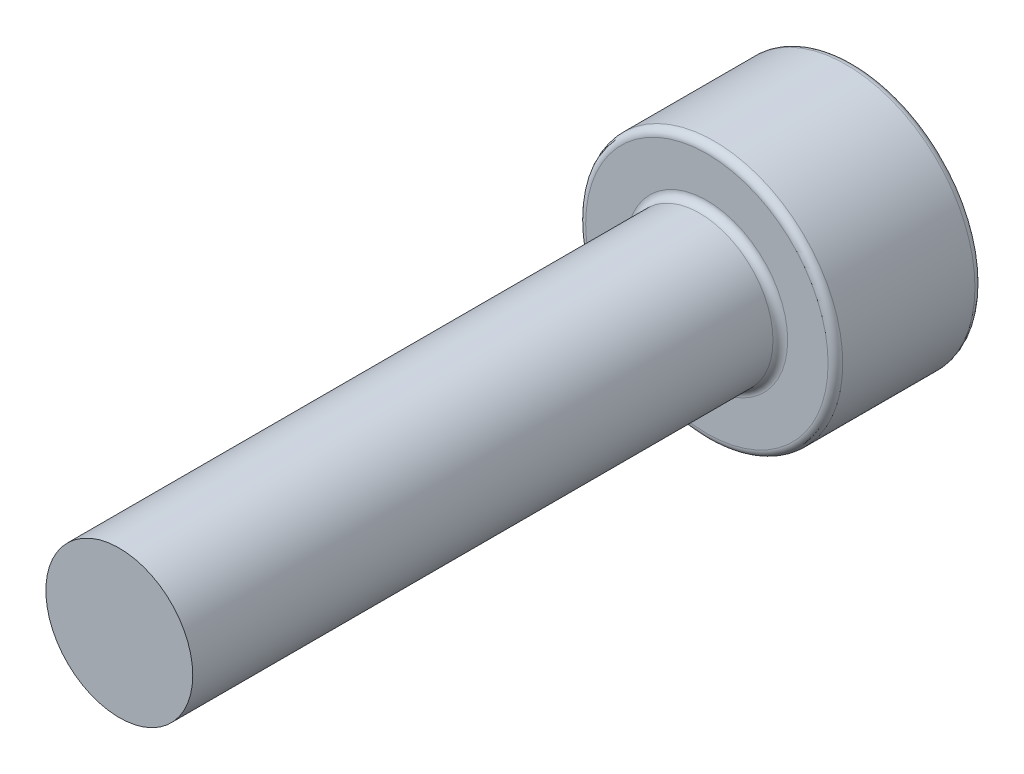
ISO-10303-21;
HEADER;
FILE_DESCRIPTION(('STEP AP214'),'2;1');
FILE_NAME('part.step','',(''),(''),'','','');
FILE_SCHEMA(('AUTOMOTIVE_DESIGN { 1 0 10303 214 1 1 1 1 }'));
ENDSEC;
DATA;
#1=APPLICATION_CONTEXT('core data for automotive mechanical design processes');
#2=APPLICATION_PROTOCOL_DEFINITION('international standard','automotive_design',2000,#1);
#3=PRODUCT_CONTEXT('',#1,'mechanical');
#4=PRODUCT('Part','Part','',(#3));
#5=PRODUCT_RELATED_PRODUCT_CATEGORY('part','',(#4));
#6=PRODUCT_DEFINITION_FORMATION('','',#4);
#7=PRODUCT_DEFINITION_CONTEXT('part definition',#1,'design');
#8=PRODUCT_DEFINITION('design','',#6,#7);
#9=PRODUCT_DEFINITION_SHAPE('','',#8);
#10=(LENGTH_UNIT() NAMED_UNIT(*) SI_UNIT(.MILLI.,.METRE.));
#11=(NAMED_UNIT(*) PLANE_ANGLE_UNIT() SI_UNIT($,.RADIAN.));
#12=(NAMED_UNIT(*) SI_UNIT($,.STERADIAN.) SOLID_ANGLE_UNIT());
#13=UNCERTAINTY_MEASURE_WITH_UNIT(LENGTH_MEASURE(1.E-05),#10,'distance_accuracy_value','');
#14=(GEOMETRIC_REPRESENTATION_CONTEXT(3) GLOBAL_UNCERTAINTY_ASSIGNED_CONTEXT((#13)) GLOBAL_UNIT_ASSIGNED_CONTEXT((#10,
#11,#12)) REPRESENTATION_CONTEXT('',''));
#15=CARTESIAN_POINT('',(0.,0.,0.));
#16=DIRECTION('',(0.,0.,1.));
#17=DIRECTION('',(1.,0.,0.));
#18=AXIS2_PLACEMENT_3D('',#15,#16,#17);
#19=CARTESIAN_POINT('',(-0.577350269189626,-1.,2.));
#20=DIRECTION('',(0.,1.,0.));
#21=DIRECTION('',(0.,0.,1.));
#22=AXIS2_PLACEMENT_3D('',#19,#20,#21);
#23=PLANE('',#22);
#24=DIRECTION('',(0.,0.,-1.));
#25=VECTOR('',#24,1.);
#26=CARTESIAN_POINT('',(-0.577350269189626,-1.,2.));
#27=LINE('',#26,#25);
#28=CARTESIAN_POINT('',(-0.577350269189626,-1.,1.75));
#29=VERTEX_POINT('',#28);
#30=CARTESIAN_POINT('',(-0.577350269189627,-1.,0.));
#31=VERTEX_POINT('',#30);
#32=EDGE_CURVE('E57',#29,#31,#27,.T.);
#33=ORIENTED_EDGE('',*,*,#32,.F.);
#34=DIRECTION('',(1.,0.,0.));
#35=VECTOR('',#34,1.);
#36=CARTESIAN_POINT('',(-0.577350269189626,-1.,1.75));
#37=LINE('',#36,#35);
#38=CARTESIAN_POINT('',(0.577350269189626,-1.,1.75));
#39=VERTEX_POINT('',#38);
#40=EDGE_CURVE('E50',#29,#39,#37,.T.);
#41=ORIENTED_EDGE('',*,*,#40,.T.);
#42=DIRECTION('',(0.,0.,-1.));
#43=VECTOR('',#42,1.);
#44=CARTESIAN_POINT('',(0.577350269189626,-1.,2.));
#45=LINE('',#44,#43);
#46=CARTESIAN_POINT('',(0.577350269189626,-1.,0.));
#47=VERTEX_POINT('',#46);
#48=EDGE_CURVE('E93',#39,#47,#45,.T.);
#49=ORIENTED_EDGE('',*,*,#48,.T.);
#50=DIRECTION('',(1.,0.,0.));
#51=VECTOR('',#50,1.);
#52=CARTESIAN_POINT('',(-0.577350269189626,-1.,0.));
#53=LINE('',#52,#51);
#54=EDGE_CURVE('E199',#31,#47,#53,.T.);
#55=ORIENTED_EDGE('',*,*,#54,.F.);
#56=EDGE_LOOP('',(#33,#41,#49,#55));
#57=FACE_BOUND('',#56,.T.);
#58=ADVANCED_FACE('F35',(#57),#23,.T.);
#59=CARTESIAN_POINT('',(0.577350269189626,-1.,2.));
#60=DIRECTION('',(-0.866025403784439,0.5,0.));
#61=DIRECTION('',(-0.5,-0.866025403784439,0.));
#62=AXIS2_PLACEMENT_3D('',#59,#60,#61);
#63=PLANE('',#62);
#64=ORIENTED_EDGE('',*,*,#48,.F.);
#65=DIRECTION('',(0.5,0.866025403784439,0.));
#66=VECTOR('',#65,1.);
#67=CARTESIAN_POINT('',(0.577350269189626,-1.,1.75));
#68=LINE('',#67,#66);
#69=CARTESIAN_POINT('',(1.15470053837925,0.,1.75));
#70=VERTEX_POINT('',#69);
#71=EDGE_CURVE('E195',#39,#70,#68,.T.);
#72=ORIENTED_EDGE('',*,*,#71,.T.);
#73=DIRECTION('',(0.,0.,-1.));
#74=VECTOR('',#73,1.);
#75=CARTESIAN_POINT('',(1.15470053837925,0.,2.));
#76=LINE('',#75,#74);
#77=CARTESIAN_POINT('',(1.15470053837925,0.,0.));
#78=VERTEX_POINT('',#77);
#79=EDGE_CURVE('E115',#70,#78,#76,.T.);
#80=ORIENTED_EDGE('',*,*,#79,.T.);
#81=DIRECTION('',(0.5,0.866025403784439,0.));
#82=VECTOR('',#81,1.);
#83=CARTESIAN_POINT('',(0.577350269189626,-1.,0.));
#84=LINE('',#83,#82);
#85=EDGE_CURVE('E202',#47,#78,#84,.T.);
#86=ORIENTED_EDGE('',*,*,#85,.F.);
#87=EDGE_LOOP('',(#64,#72,#80,#86));
#88=FACE_BOUND('',#87,.T.);
#89=ADVANCED_FACE('F154',(#88),#63,.T.);
#90=CARTESIAN_POINT('',(1.15470053837925,0.,2.));
#91=DIRECTION('',(-0.866025403784439,-0.5,0.));
#92=DIRECTION('',(0.5,-0.866025403784439,0.));
#93=AXIS2_PLACEMENT_3D('',#90,#91,#92);
#94=PLANE('',#93);
#95=ORIENTED_EDGE('',*,*,#79,.F.);
#96=DIRECTION('',(-0.5,0.866025403784439,0.));
#97=VECTOR('',#96,1.);
#98=CARTESIAN_POINT('',(1.15470053837925,0.,1.75));
#99=LINE('',#98,#97);
#100=CARTESIAN_POINT('',(0.577350269189626,1.,1.75));
#101=VERTEX_POINT('',#100);
#102=EDGE_CURVE('E192',#70,#101,#99,.T.);
#103=ORIENTED_EDGE('',*,*,#102,.T.);
#104=DIRECTION('',(0.,0.,-1.));
#105=VECTOR('',#104,1.);
#106=CARTESIAN_POINT('',(0.577350269189626,1.,2.));
#107=LINE('',#106,#105);
#108=CARTESIAN_POINT('',(0.577350269189626,1.,0.));
#109=VERTEX_POINT('',#108);
#110=EDGE_CURVE('E109',#101,#109,#107,.T.);
#111=ORIENTED_EDGE('',*,*,#110,.T.);
#112=DIRECTION('',(-0.5,0.866025403784439,0.));
#113=VECTOR('',#112,1.);
#114=CARTESIAN_POINT('',(1.15470053837925,0.,0.));
#115=LINE('',#114,#113);
#116=EDGE_CURVE('E205',#78,#109,#115,.T.);
#117=ORIENTED_EDGE('',*,*,#116,.F.);
#118=EDGE_LOOP('',(#95,#103,#111,#117));
#119=FACE_BOUND('',#118,.T.);
#120=ADVANCED_FACE('F159',(#119),#94,.T.);
#121=CARTESIAN_POINT('',(0.577350269189626,1.,2.));
#122=DIRECTION('',(0.,-1.,0.));
#123=DIRECTION('',(0.,0.,-1.));
#124=AXIS2_PLACEMENT_3D('',#121,#122,#123);
#125=PLANE('',#124);
#126=ORIENTED_EDGE('',*,*,#110,.F.);
#127=DIRECTION('',(-1.,0.,0.));
#128=VECTOR('',#127,1.);
#129=CARTESIAN_POINT('',(0.577350269189626,1.,1.75));
#130=LINE('',#129,#128);
#131=CARTESIAN_POINT('',(-0.577350269189626,1.,1.75));
#132=VERTEX_POINT('',#131);
#133=EDGE_CURVE('E101',#101,#132,#130,.T.);
#134=ORIENTED_EDGE('',*,*,#133,.T.);
#135=DIRECTION('',(0.,0.,-1.));
#136=VECTOR('',#135,1.);
#137=CARTESIAN_POINT('',(-0.577350269189626,1.,2.));
#138=LINE('',#137,#136);
#139=CARTESIAN_POINT('',(-0.577350269189626,1.,0.));
#140=VERTEX_POINT('',#139);
#141=EDGE_CURVE('E100',#132,#140,#138,.T.);
#142=ORIENTED_EDGE('',*,*,#141,.T.);
#143=DIRECTION('',(-1.,0.,0.));
#144=VECTOR('',#143,1.);
#145=CARTESIAN_POINT('',(0.577350269189626,1.,0.));
#146=LINE('',#145,#144);
#147=EDGE_CURVE('E208',#109,#140,#146,.T.);
#148=ORIENTED_EDGE('',*,*,#147,.F.);
#149=EDGE_LOOP('',(#126,#134,#142,#148));
#150=FACE_BOUND('',#149,.T.);
#151=ADVANCED_FACE('F165',(#150),#125,.T.);
#152=CARTESIAN_POINT('',(-0.577350269189626,1.,2.));
#153=DIRECTION('',(0.866025403784439,-0.5,0.));
#154=DIRECTION('',(0.5,0.866025403784439,0.));
#155=AXIS2_PLACEMENT_3D('',#152,#153,#154);
#156=PLANE('',#155);
#157=ORIENTED_EDGE('',*,*,#141,.F.);
#158=DIRECTION('',(-0.5,-0.866025403784439,0.));
#159=VECTOR('',#158,1.);
#160=CARTESIAN_POINT('',(-0.577350269189626,1.,1.75));
#161=LINE('',#160,#159);
#162=CARTESIAN_POINT('',(-1.15470053837925,0.,1.75));
#163=VERTEX_POINT('',#162);
#164=EDGE_CURVE('E89',#132,#163,#161,.T.);
#165=ORIENTED_EDGE('',*,*,#164,.T.);
#166=DIRECTION('',(0.,0.,-1.));
#167=VECTOR('',#166,1.);
#168=CARTESIAN_POINT('',(-1.15470053837925,0.,2.));
#169=LINE('',#168,#167);
#170=CARTESIAN_POINT('',(-1.15470053837925,0.,0.));
#171=VERTEX_POINT('',#170);
#172=EDGE_CURVE('E99',#163,#171,#169,.T.);
#173=ORIENTED_EDGE('',*,*,#172,.T.);
#174=DIRECTION('',(-0.5,-0.866025403784439,0.));
#175=VECTOR('',#174,1.);
#176=CARTESIAN_POINT('',(-0.577350269189626,1.,0.));
#177=LINE('',#176,#175);
#178=EDGE_CURVE('E211',#140,#171,#177,.T.);
#179=ORIENTED_EDGE('',*,*,#178,.F.);
#180=EDGE_LOOP('',(#157,#165,#173,#179));
#181=FACE_BOUND('',#180,.T.);
#182=ADVANCED_FACE('F97',(#181),#156,.T.);
#183=CARTESIAN_POINT('',(-1.15470053837925,0.,2.));
#184=DIRECTION('',(0.866025403784439,0.5,0.));
#185=DIRECTION('',(-0.5,0.866025403784439,0.));
#186=AXIS2_PLACEMENT_3D('',#183,#184,#185);
#187=PLANE('',#186);
#188=ORIENTED_EDGE('',*,*,#172,.F.);
#189=DIRECTION('',(0.5,-0.866025403784439,0.));
#190=VECTOR('',#189,1.);
#191=CARTESIAN_POINT('',(-1.15470053837925,0.,1.75));
#192=LINE('',#191,#190);
#193=EDGE_CURVE('E86',#163,#29,#192,.T.);
#194=ORIENTED_EDGE('',*,*,#193,.T.);
#195=ORIENTED_EDGE('',*,*,#32,.T.);
#196=DIRECTION('',(0.5,-0.866025403784439,0.));
#197=VECTOR('',#196,1.);
#198=CARTESIAN_POINT('',(-1.15470053837925,0.,0.));
#199=LINE('',#198,#197);
#200=EDGE_CURVE('E106',#171,#31,#199,.T.);
#201=ORIENTED_EDGE('',*,*,#200,.F.);
#202=EDGE_LOOP('',(#188,#194,#195,#201));
#203=FACE_BOUND('',#202,.T.);
#204=ADVANCED_FACE('F104',(#203),#187,.T.);
#205=CARTESIAN_POINT('',(0.,0.,2.));
#206=DIRECTION('',(0.,0.,1.));
#207=DIRECTION('',(1.,0.,0.));
#208=AXIS2_PLACEMENT_3D('',#205,#206,#207);
#209=PLANE('',#208);
#210=CARTESIAN_POINT('',(0.,0.,2.));
#211=DIRECTION('',(0.,0.,1.));
#212=DIRECTION('',(1.,0.,0.));
#213=AXIS2_PLACEMENT_3D('',#210,#211,#212);
#214=CIRCLE('',#213,1.1);
#215=CARTESIAN_POINT('',(1.1,0.,2.));
#216=VERTEX_POINT('',#215);
#217=EDGE_CURVE('E123',#216,#216,#214,.F.);
#218=ORIENTED_EDGE('',*,*,#217,.T.);
#219=EDGE_LOOP('',(#218));
#220=FACE_BOUND('',#219,.T.);
#221=CARTESIAN_POINT('',(0.,0.,2.));
#222=DIRECTION('',(0.,0.,1.));
#223=DIRECTION('',(1.,0.,0.));
#224=AXIS2_PLACEMENT_3D('',#221,#222,#223);
#225=CIRCLE('',#224,1.65);
#226=CARTESIAN_POINT('',(1.65,0.,2.));
#227=VERTEX_POINT('',#226);
#228=EDGE_CURVE('E120',#227,#227,#225,.T.);
#229=ORIENTED_EDGE('',*,*,#228,.T.);
#230=EDGE_LOOP('',(#229));
#231=FACE_BOUND('',#230,.T.);
#232=ADVANCED_FACE('F140',(#220,#231),#209,.T.);
#233=CARTESIAN_POINT('',(0.,0.,0.));
#234=DIRECTION('',(0.,0.,1.));
#235=DIRECTION('',(1.,0.,0.));
#236=AXIS2_PLACEMENT_3D('',#233,#234,#235);
#237=PLANE('',#236);
#238=CARTESIAN_POINT('',(0.,0.,0.));
#239=DIRECTION('',(0.,0.,1.));
#240=DIRECTION('',(1.,0.,0.));
#241=AXIS2_PLACEMENT_3D('',#238,#239,#240);
#242=CIRCLE('',#241,1.65);
#243=CARTESIAN_POINT('',(1.65,0.,0.));
#244=VERTEX_POINT('',#243);
#245=EDGE_CURVE('E11',#244,#244,#242,.F.);
#246=ORIENTED_EDGE('',*,*,#245,.T.);
#247=EDGE_LOOP('',(#246));
#248=FACE_BOUND('',#247,.T.);
#249=ORIENTED_EDGE('',*,*,#54,.T.);
#250=ORIENTED_EDGE('',*,*,#85,.T.);
#251=ORIENTED_EDGE('',*,*,#116,.T.);
#252=ORIENTED_EDGE('',*,*,#147,.T.);
#253=ORIENTED_EDGE('',*,*,#178,.T.);
#254=ORIENTED_EDGE('',*,*,#200,.T.);
#255=EDGE_LOOP('',(#249,#250,#251,#252,#253,#254));
#256=FACE_BOUND('',#255,.T.);
#257=ADVANCED_FACE('F142',(#248,#256),#237,.F.);
#258=CARTESIAN_POINT('',(0.,0.,2.));
#259=DIRECTION('',(0.,0.,-1.));
#260=DIRECTION('',(-1.,0.,0.));
#261=AXIS2_PLACEMENT_3D('',#258,#259,#260);
#262=CYLINDRICAL_SURFACE('',#261,1.75);
#263=CARTESIAN_POINT('',(0.,0.,1.9));
#264=DIRECTION('',(0.,0.,1.));
#265=DIRECTION('',(1.,0.,0.));
#266=AXIS2_PLACEMENT_3D('',#263,#264,#265);
#267=CIRCLE('',#266,1.75);
#268=CARTESIAN_POINT('',(1.75,0.,1.9));
#269=VERTEX_POINT('',#268);
#270=EDGE_CURVE('E43',#269,#269,#267,.F.);
#271=ORIENTED_EDGE('',*,*,#270,.T.);
#272=EDGE_LOOP('',(#271));
#273=FACE_BOUND('',#272,.T.);
#274=CARTESIAN_POINT('',(0.,0.,0.1));
#275=DIRECTION('',(0.,0.,1.));
#276=DIRECTION('',(1.,0.,0.));
#277=AXIS2_PLACEMENT_3D('',#274,#275,#276);
#278=CIRCLE('',#277,1.75);
#279=CARTESIAN_POINT('',(1.75,0.,0.1));
#280=VERTEX_POINT('',#279);
#281=EDGE_CURVE('E126',#280,#280,#278,.T.);
#282=ORIENTED_EDGE('',*,*,#281,.T.);
#283=EDGE_LOOP('',(#282));
#284=FACE_BOUND('',#283,.T.);
#285=ADVANCED_FACE('F131',(#273,#284),#262,.T.);
#286=CARTESIAN_POINT('',(0.,0.,1.75));
#287=DIRECTION('',(0.,0.,1.));
#288=DIRECTION('',(1.,0.,0.));
#289=AXIS2_PLACEMENT_3D('',#286,#287,#288);
#290=PLANE('',#289);
#291=ORIENTED_EDGE('',*,*,#40,.F.);
#292=ORIENTED_EDGE('',*,*,#193,.F.);
#293=ORIENTED_EDGE('',*,*,#164,.F.);
#294=ORIENTED_EDGE('',*,*,#133,.F.);
#295=ORIENTED_EDGE('',*,*,#102,.F.);
#296=ORIENTED_EDGE('',*,*,#71,.F.);
#297=EDGE_LOOP('',(#291,#292,#293,#294,#295,#296));
#298=FACE_BOUND('',#297,.T.);
#299=ADVANCED_FACE('F88',(#298),#290,.F.);
#300=CARTESIAN_POINT('',(0.,0.,10.));
#301=DIRECTION('',(0.,0.,-1.));
#302=DIRECTION('',(-1.,0.,0.));
#303=AXIS2_PLACEMENT_3D('',#300,#301,#302);
#304=CYLINDRICAL_SURFACE('',#303,1.);
#305=CARTESIAN_POINT('',(0.,0.,2.1));
#306=DIRECTION('',(0.,0.,1.));
#307=DIRECTION('',(1.,0.,0.));
#308=AXIS2_PLACEMENT_3D('',#305,#306,#307);
#309=CIRCLE('',#308,1.);
#310=CARTESIAN_POINT('',(1.,0.,2.1));
#311=VERTEX_POINT('',#310);
#312=EDGE_CURVE('E92',#311,#311,#309,.T.);
#313=ORIENTED_EDGE('',*,*,#312,.T.);
#314=EDGE_LOOP('',(#313));
#315=FACE_BOUND('',#314,.T.);
#316=CARTESIAN_POINT('',(0.,0.,10.));
#317=DIRECTION('',(0.,0.,1.));
#318=DIRECTION('',(1.,0.,0.));
#319=AXIS2_PLACEMENT_3D('',#316,#317,#318);
#320=CIRCLE('',#319,1.);
#321=CARTESIAN_POINT('',(1.,0.,10.));
#322=VERTEX_POINT('',#321);
#323=EDGE_CURVE('E102',#322,#322,#320,.T.);
#324=ORIENTED_EDGE('',*,*,#323,.F.);
#325=EDGE_LOOP('',(#324));
#326=FACE_BOUND('',#325,.T.);
#327=ADVANCED_FACE('F174',(#315,#326),#304,.T.);
#328=CARTESIAN_POINT('',(0.,0.,10.));
#329=DIRECTION('',(0.,0.,1.));
#330=DIRECTION('',(1.,0.,0.));
#331=AXIS2_PLACEMENT_3D('',#328,#329,#330);
#332=PLANE('',#331);
#333=ORIENTED_EDGE('',*,*,#323,.T.);
#334=EDGE_LOOP('',(#333));
#335=FACE_BOUND('',#334,.T.);
#336=ADVANCED_FACE('F177',(#335),#332,.T.);
#337=CARTESIAN_POINT('',(0.,0.,2.1));
#338=DIRECTION('',(0.,0.,1.));
#339=DIRECTION('',(1.,0.,0.));
#340=AXIS2_PLACEMENT_3D('',#337,#338,#339);
#341=TOROIDAL_SURFACE('',#340,1.1,0.1);
#342=ORIENTED_EDGE('',*,*,#217,.F.);
#343=EDGE_LOOP('',(#342));
#344=FACE_BOUND('',#343,.T.);
#345=ORIENTED_EDGE('',*,*,#312,.F.);
#346=EDGE_LOOP('',(#345));
#347=FACE_BOUND('',#346,.T.);
#348=ADVANCED_FACE('F137',(#344,#347),#341,.F.);
#349=CARTESIAN_POINT('',(0.,0.,1.9));
#350=DIRECTION('',(0.,0.,1.));
#351=DIRECTION('',(1.,0.,0.));
#352=AXIS2_PLACEMENT_3D('',#349,#350,#351);
#353=TOROIDAL_SURFACE('',#352,1.65,0.1);
#354=ORIENTED_EDGE('',*,*,#270,.F.);
#355=EDGE_LOOP('',(#354));
#356=FACE_BOUND('',#355,.T.);
#357=ORIENTED_EDGE('',*,*,#228,.F.);
#358=EDGE_LOOP('',(#357));
#359=FACE_BOUND('',#358,.T.);
#360=ADVANCED_FACE('F134',(#356,#359),#353,.T.);
#361=CARTESIAN_POINT('',(0.,0.,0.1));
#362=DIRECTION('',(0.,0.,1.));
#363=DIRECTION('',(1.,0.,0.));
#364=AXIS2_PLACEMENT_3D('',#361,#362,#363);
#365=TOROIDAL_SURFACE('',#364,1.65,0.1);
#366=ORIENTED_EDGE('',*,*,#245,.F.);
#367=EDGE_LOOP('',(#366));
#368=FACE_BOUND('',#367,.T.);
#369=ORIENTED_EDGE('',*,*,#281,.F.);
#370=EDGE_LOOP('',(#369));
#371=FACE_BOUND('',#370,.T.);
#372=ADVANCED_FACE('F37',(#368,#371),#365,.T.);
#373=CLOSED_SHELL('',(#58,#89,#120,#151,#182,#204,#232,#257,#285,#299,#327,#336,#348,#360,#372));
#374=MANIFOLD_SOLID_BREP('B2',#373);
#375=ADVANCED_BREP_SHAPE_REPRESENTATION('',(#18,#374),#14);
#376=SHAPE_DEFINITION_REPRESENTATION(#9,#375);
ENDSEC;
END-ISO-10303-21;
